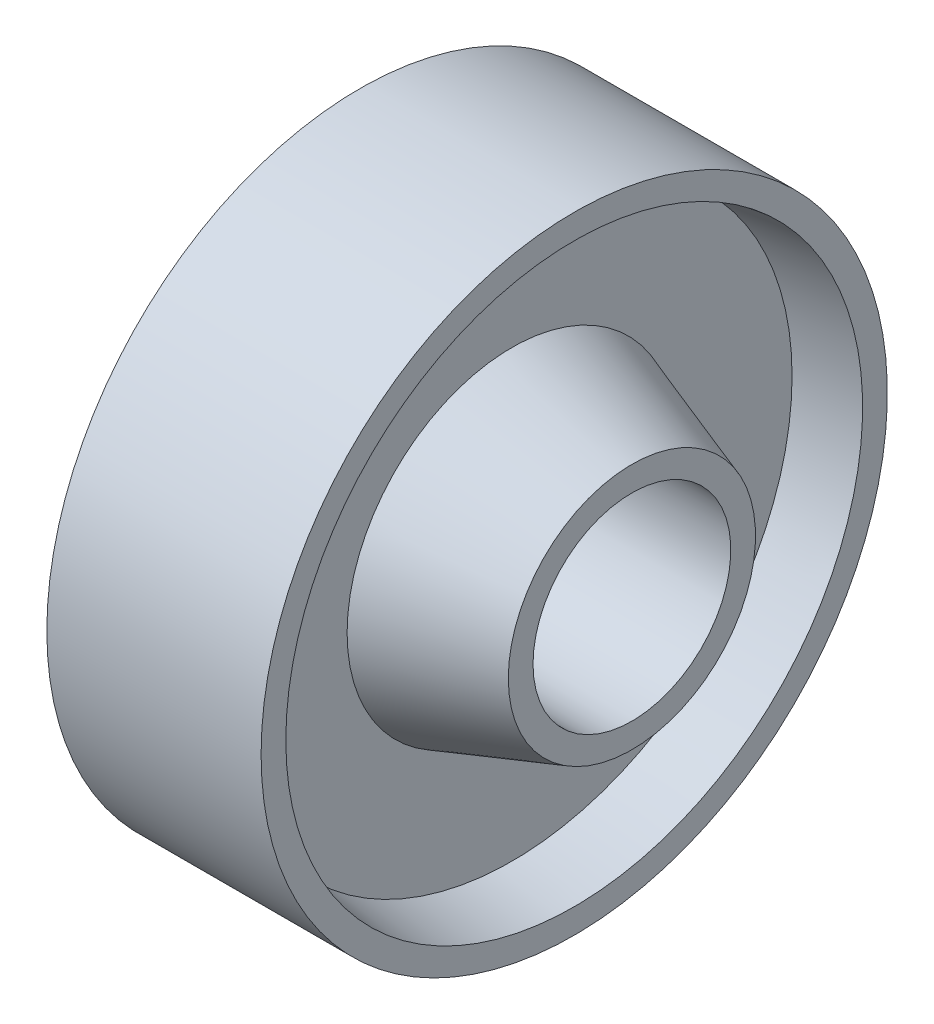
ISO-10303-21;
HEADER;
FILE_DESCRIPTION(('STEP AP214'),'2;1');
FILE_NAME('part.step','',(''),(''),'','','');
FILE_SCHEMA(('AUTOMOTIVE_DESIGN { 1 0 10303 214 1 1 1 1 }'));
ENDSEC;
DATA;
#1=APPLICATION_CONTEXT('core data for automotive mechanical design processes');
#2=APPLICATION_PROTOCOL_DEFINITION('international standard','automotive_design',2000,#1);
#3=PRODUCT_CONTEXT('',#1,'mechanical');
#4=PRODUCT('Part','Part','',(#3));
#5=PRODUCT_RELATED_PRODUCT_CATEGORY('part','',(#4));
#6=PRODUCT_DEFINITION_FORMATION('','',#4);
#7=PRODUCT_DEFINITION_CONTEXT('part definition',#1,'design');
#8=PRODUCT_DEFINITION('design','',#6,#7);
#9=PRODUCT_DEFINITION_SHAPE('','',#8);
#10=(LENGTH_UNIT() NAMED_UNIT(*) SI_UNIT(.MILLI.,.METRE.));
#11=(NAMED_UNIT(*) PLANE_ANGLE_UNIT() SI_UNIT($,.RADIAN.));
#12=(NAMED_UNIT(*) SI_UNIT($,.STERADIAN.) SOLID_ANGLE_UNIT());
#13=UNCERTAINTY_MEASURE_WITH_UNIT(LENGTH_MEASURE(1.E-05),#10,'distance_accuracy_value','');
#14=(GEOMETRIC_REPRESENTATION_CONTEXT(3) GLOBAL_UNCERTAINTY_ASSIGNED_CONTEXT((#13)) GLOBAL_UNIT_ASSIGNED_CONTEXT((#10,
#11,#12)) REPRESENTATION_CONTEXT('',''));
#15=CARTESIAN_POINT('',(0.,0.,0.));
#16=DIRECTION('',(0.,0.,1.));
#17=DIRECTION('',(1.,0.,0.));
#18=AXIS2_PLACEMENT_3D('',#15,#16,#17);
#19=CARTESIAN_POINT('',(-21.0138248847926,12.,0.));
#20=DIRECTION('',(1.,0.,0.));
#21=DIRECTION('',(0.,0.,-1.));
#22=AXIS2_PLACEMENT_3D('',#19,#20,#21);
#23=PLANE('',#22);
#24=CARTESIAN_POINT('',(-21.0138248847926,0.,0.));
#25=DIRECTION('',(-1.,0.,0.));
#26=DIRECTION('',(0.,0.,1.));
#27=AXIS2_PLACEMENT_3D('',#24,#25,#26);
#28=CIRCLE('',#27,12.);
#29=CARTESIAN_POINT('',(-21.0138248847926,0.,12.));
#30=VERTEX_POINT('',#29);
#31=EDGE_CURVE('E77',#30,#30,#28,.T.);
#32=ORIENTED_EDGE('',*,*,#31,.F.);
#33=EDGE_LOOP('',(#32));
#34=FACE_BOUND('',#33,.T.);
#35=CARTESIAN_POINT('',(-21.0138248847926,0.,0.));
#36=DIRECTION('',(-1.,0.,0.));
#37=DIRECTION('',(0.,0.,1.));
#38=AXIS2_PLACEMENT_3D('',#35,#36,#37);
#39=CIRCLE('',#38,15.);
#40=CARTESIAN_POINT('',(-21.0138248847926,0.,15.));
#41=VERTEX_POINT('',#40);
#42=EDGE_CURVE('E10',#41,#41,#39,.T.);
#43=ORIENTED_EDGE('',*,*,#42,.T.);
#44=EDGE_LOOP('',(#43));
#45=FACE_BOUND('',#44,.T.);
#46=ADVANCED_FACE('F37',(#34,#45),#23,.F.);
#47=CARTESIAN_POINT('',(-6.4516129032258,0.,0.));
#48=DIRECTION('',(1.,0.,0.));
#49=DIRECTION('',(0.,0.,-1.));
#50=AXIS2_PLACEMENT_3D('',#47,#48,#49);
#51=CONICAL_SURFACE('',#50,20.,0.330742266626463);
#52=ORIENTED_EDGE('',*,*,#42,.F.);
#53=EDGE_LOOP('',(#52));
#54=FACE_BOUND('',#53,.T.);
#55=CARTESIAN_POINT('',(-6.4516129032258,0.,0.));
#56=DIRECTION('',(-1.,0.,0.));
#57=DIRECTION('',(0.,0.,1.));
#58=AXIS2_PLACEMENT_3D('',#55,#56,#57);
#59=CIRCLE('',#58,20.);
#60=CARTESIAN_POINT('',(-6.4516129032258,0.,20.));
#61=VERTEX_POINT('',#60);
#62=EDGE_CURVE('E43',#61,#61,#59,.T.);
#63=ORIENTED_EDGE('',*,*,#62,.T.);
#64=EDGE_LOOP('',(#63));
#65=FACE_BOUND('',#64,.T.);
#66=ADVANCED_FACE('F84',(#54,#65),#51,.T.);
#67=CARTESIAN_POINT('',(-6.45161290322579,34.,0.));
#68=DIRECTION('',(1.,0.,0.));
#69=DIRECTION('',(0.,0.,-1.));
#70=AXIS2_PLACEMENT_3D('',#67,#68,#69);
#71=PLANE('',#70);
#72=ORIENTED_EDGE('',*,*,#62,.F.);
#73=EDGE_LOOP('',(#72));
#74=FACE_BOUND('',#73,.T.);
#75=CARTESIAN_POINT('',(-6.4516129032258,0.,0.));
#76=DIRECTION('',(-1.,0.,0.));
#77=DIRECTION('',(0.,0.,1.));
#78=AXIS2_PLACEMENT_3D('',#75,#76,#77);
#79=CIRCLE('',#78,34.);
#80=CARTESIAN_POINT('',(-6.4516129032258,0.,34.));
#81=VERTEX_POINT('',#80);
#82=EDGE_CURVE('E47',#81,#81,#79,.T.);
#83=ORIENTED_EDGE('',*,*,#82,.T.);
#84=EDGE_LOOP('',(#83));
#85=FACE_BOUND('',#84,.T.);
#86=ADVANCED_FACE('F88',(#74,#85),#71,.F.);
#87=CARTESIAN_POINT('',(-14.0138248847926,0.,0.));
#88=DIRECTION('',(-1.,0.,0.));
#89=DIRECTION('',(0.,0.,1.));
#90=AXIS2_PLACEMENT_3D('',#87,#88,#89);
#91=CONICAL_SURFACE('',#90,35.,0.131473645373306);
#92=ORIENTED_EDGE('',*,*,#82,.F.);
#93=EDGE_LOOP('',(#92));
#94=FACE_BOUND('',#93,.T.);
#95=CARTESIAN_POINT('',(-14.0138248847926,0.,0.));
#96=DIRECTION('',(-1.,0.,0.));
#97=DIRECTION('',(0.,0.,1.));
#98=AXIS2_PLACEMENT_3D('',#95,#96,#97);
#99=CIRCLE('',#98,35.);
#100=CARTESIAN_POINT('',(-14.0138248847926,0.,35.));
#101=VERTEX_POINT('',#100);
#102=EDGE_CURVE('E51',#101,#101,#99,.T.);
#103=ORIENTED_EDGE('',*,*,#102,.T.);
#104=EDGE_LOOP('',(#103));
#105=FACE_BOUND('',#104,.T.);
#106=ADVANCED_FACE('F93',(#94,#105),#91,.F.);
#107=CARTESIAN_POINT('',(-14.0138248847926,38.,0.));
#108=DIRECTION('',(1.,0.,0.));
#109=DIRECTION('',(0.,0.,-1.));
#110=AXIS2_PLACEMENT_3D('',#107,#108,#109);
#111=PLANE('',#110);
#112=ORIENTED_EDGE('',*,*,#102,.F.);
#113=EDGE_LOOP('',(#112));
#114=FACE_BOUND('',#113,.T.);
#115=CARTESIAN_POINT('',(-14.0138248847926,0.,0.));
#116=DIRECTION('',(-1.,0.,0.));
#117=DIRECTION('',(0.,0.,1.));
#118=AXIS2_PLACEMENT_3D('',#115,#116,#117);
#119=CIRCLE('',#118,38.);
#120=CARTESIAN_POINT('',(-14.0138248847926,0.,38.));
#121=VERTEX_POINT('',#120);
#122=EDGE_CURVE('E56',#121,#121,#119,.T.);
#123=ORIENTED_EDGE('',*,*,#122,.T.);
#124=EDGE_LOOP('',(#123));
#125=FACE_BOUND('',#124,.T.);
#126=ADVANCED_FACE('F99',(#114,#125),#111,.F.);
#127=CARTESIAN_POINT('',(-39.0783410138249,0.,0.));
#128=DIRECTION('',(-1.,0.,0.));
#129=DIRECTION('',(0.,0.,1.));
#130=AXIS2_PLACEMENT_3D('',#127,#128,#129);
#131=CYLINDRICAL_SURFACE('',#130,38.);
#132=ORIENTED_EDGE('',*,*,#122,.F.);
#133=EDGE_LOOP('',(#132));
#134=FACE_BOUND('',#133,.T.);
#135=CARTESIAN_POINT('',(11.9861751152074,0.,0.));
#136=DIRECTION('',(-1.,0.,0.));
#137=DIRECTION('',(0.,0.,1.));
#138=AXIS2_PLACEMENT_3D('',#135,#136,#137);
#139=CIRCLE('',#138,38.);
#140=CARTESIAN_POINT('',(11.9861751152074,0.,38.));
#141=VERTEX_POINT('',#140);
#142=EDGE_CURVE('E59',#141,#141,#139,.T.);
#143=ORIENTED_EDGE('',*,*,#142,.T.);
#144=EDGE_LOOP('',(#143));
#145=FACE_BOUND('',#144,.T.);
#146=ADVANCED_FACE('F103',(#134,#145),#131,.T.);
#147=CARTESIAN_POINT('',(11.9861751152074,38.,0.));
#148=DIRECTION('',(-1.,0.,0.));
#149=DIRECTION('',(0.,0.,1.));
#150=AXIS2_PLACEMENT_3D('',#147,#148,#149);
#151=PLANE('',#150);
#152=ORIENTED_EDGE('',*,*,#142,.F.);
#153=EDGE_LOOP('',(#152));
#154=FACE_BOUND('',#153,.T.);
#155=CARTESIAN_POINT('',(11.9861751152074,0.,0.));
#156=DIRECTION('',(-1.,0.,0.));
#157=DIRECTION('',(0.,0.,1.));
#158=AXIS2_PLACEMENT_3D('',#155,#156,#157);
#159=CIRCLE('',#158,35.);
#160=CARTESIAN_POINT('',(11.9861751152074,0.,35.));
#161=VERTEX_POINT('',#160);
#162=EDGE_CURVE('E62',#161,#161,#159,.T.);
#163=ORIENTED_EDGE('',*,*,#162,.T.);
#164=EDGE_LOOP('',(#163));
#165=FACE_BOUND('',#164,.T.);
#166=ADVANCED_FACE('F107',(#154,#165),#151,.F.);
#167=CARTESIAN_POINT('',(4.42396313364057,0.,0.));
#168=DIRECTION('',(1.,0.,0.));
#169=DIRECTION('',(0.,0.,-1.));
#170=AXIS2_PLACEMENT_3D('',#167,#168,#169);
#171=CONICAL_SURFACE('',#170,34.,0.131473645373306);
#172=ORIENTED_EDGE('',*,*,#162,.F.);
#173=EDGE_LOOP('',(#172));
#174=FACE_BOUND('',#173,.T.);
#175=CARTESIAN_POINT('',(4.42396313364057,0.,0.));
#176=DIRECTION('',(-1.,0.,0.));
#177=DIRECTION('',(0.,0.,1.));
#178=AXIS2_PLACEMENT_3D('',#175,#176,#177);
#179=CIRCLE('',#178,34.);
#180=CARTESIAN_POINT('',(4.42396313364057,0.,34.));
#181=VERTEX_POINT('',#180);
#182=EDGE_CURVE('E65',#181,#181,#179,.T.);
#183=ORIENTED_EDGE('',*,*,#182,.T.);
#184=EDGE_LOOP('',(#183));
#185=FACE_BOUND('',#184,.T.);
#186=ADVANCED_FACE('F111',(#174,#185),#171,.F.);
#187=CARTESIAN_POINT('',(4.42396313364058,34.,0.));
#188=DIRECTION('',(-1.,0.,0.));
#189=DIRECTION('',(0.,0.,1.));
#190=AXIS2_PLACEMENT_3D('',#187,#188,#189);
#191=PLANE('',#190);
#192=ORIENTED_EDGE('',*,*,#182,.F.);
#193=EDGE_LOOP('',(#192));
#194=FACE_BOUND('',#193,.T.);
#195=CARTESIAN_POINT('',(4.42396313364057,0.,0.));
#196=DIRECTION('',(-1.,0.,0.));
#197=DIRECTION('',(0.,0.,1.));
#198=AXIS2_PLACEMENT_3D('',#195,#196,#197);
#199=CIRCLE('',#198,20.);
#200=CARTESIAN_POINT('',(4.42396313364057,0.,20.));
#201=VERTEX_POINT('',#200);
#202=EDGE_CURVE('E68',#201,#201,#199,.T.);
#203=ORIENTED_EDGE('',*,*,#202,.T.);
#204=EDGE_LOOP('',(#203));
#205=FACE_BOUND('',#204,.T.);
#206=ADVANCED_FACE('F115',(#194,#205),#191,.F.);
#207=CARTESIAN_POINT('',(18.9861751152074,0.,0.));
#208=DIRECTION('',(-1.,0.,0.));
#209=DIRECTION('',(0.,0.,1.));
#210=AXIS2_PLACEMENT_3D('',#207,#208,#209);
#211=CONICAL_SURFACE('',#210,15.,0.330742266626463);
#212=ORIENTED_EDGE('',*,*,#202,.F.);
#213=EDGE_LOOP('',(#212));
#214=FACE_BOUND('',#213,.T.);
#215=CARTESIAN_POINT('',(18.9861751152074,0.,0.));
#216=DIRECTION('',(-1.,0.,0.));
#217=DIRECTION('',(0.,0.,1.));
#218=AXIS2_PLACEMENT_3D('',#215,#216,#217);
#219=CIRCLE('',#218,15.);
#220=CARTESIAN_POINT('',(18.9861751152074,0.,15.));
#221=VERTEX_POINT('',#220);
#222=EDGE_CURVE('E71',#221,#221,#219,.T.);
#223=ORIENTED_EDGE('',*,*,#222,.T.);
#224=EDGE_LOOP('',(#223));
#225=FACE_BOUND('',#224,.T.);
#226=ADVANCED_FACE('F119',(#214,#225),#211,.T.);
#227=CARTESIAN_POINT('',(18.9861751152074,12.,0.));
#228=DIRECTION('',(-1.,0.,0.));
#229=DIRECTION('',(0.,0.,1.));
#230=AXIS2_PLACEMENT_3D('',#227,#228,#229);
#231=PLANE('',#230);
#232=ORIENTED_EDGE('',*,*,#222,.F.);
#233=EDGE_LOOP('',(#232));
#234=FACE_BOUND('',#233,.T.);
#235=CARTESIAN_POINT('',(18.9861751152074,0.,0.));
#236=DIRECTION('',(-1.,0.,0.));
#237=DIRECTION('',(0.,0.,1.));
#238=AXIS2_PLACEMENT_3D('',#235,#236,#237);
#239=CIRCLE('',#238,12.);
#240=CARTESIAN_POINT('',(18.9861751152074,0.,12.));
#241=VERTEX_POINT('',#240);
#242=EDGE_CURVE('E74',#241,#241,#239,.T.);
#243=ORIENTED_EDGE('',*,*,#242,.T.);
#244=EDGE_LOOP('',(#243));
#245=FACE_BOUND('',#244,.T.);
#246=ADVANCED_FACE('F123',(#234,#245),#231,.F.);
#247=CARTESIAN_POINT('',(-39.0783410138249,0.,0.));
#248=DIRECTION('',(-1.,0.,0.));
#249=DIRECTION('',(0.,0.,1.));
#250=AXIS2_PLACEMENT_3D('',#247,#248,#249);
#251=CYLINDRICAL_SURFACE('',#250,12.);
#252=ORIENTED_EDGE('',*,*,#242,.F.);
#253=EDGE_LOOP('',(#252));
#254=FACE_BOUND('',#253,.T.);
#255=ORIENTED_EDGE('',*,*,#31,.T.);
#256=EDGE_LOOP('',(#255));
#257=FACE_BOUND('',#256,.T.);
#258=ADVANCED_FACE('F81',(#254,#257),#251,.F.);
#259=CLOSED_SHELL('',(#46,#66,#86,#106,#126,#146,#166,#186,#206,#226,#246,#258));
#260=MANIFOLD_SOLID_BREP('B2',#259);
#261=ADVANCED_BREP_SHAPE_REPRESENTATION('',(#18,#260),#14);
#262=SHAPE_DEFINITION_REPRESENTATION(#9,#261);
ENDSEC;
END-ISO-10303-21;
